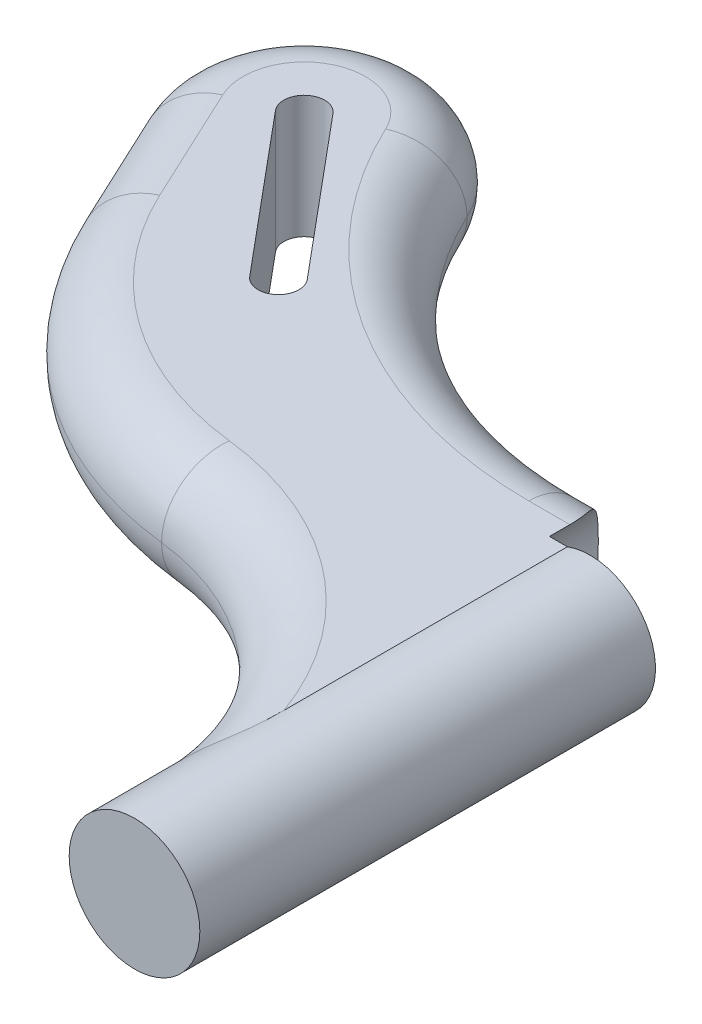
ISO-10303-21;
HEADER;
FILE_DESCRIPTION(('STEP AP214'),'2;1');
FILE_NAME('part.step','',(''),(''),'','','');
FILE_SCHEMA(('AUTOMOTIVE_DESIGN { 1 0 10303 214 1 1 1 1 }'));
ENDSEC;
DATA;
#1=APPLICATION_CONTEXT('core data for automotive mechanical design processes');
#2=APPLICATION_PROTOCOL_DEFINITION('international standard','automotive_design',2000,#1);
#3=PRODUCT_CONTEXT('',#1,'mechanical');
#4=PRODUCT('Part','Part','',(#3));
#5=PRODUCT_RELATED_PRODUCT_CATEGORY('part','',(#4));
#6=PRODUCT_DEFINITION_FORMATION('','',#4);
#7=PRODUCT_DEFINITION_CONTEXT('part definition',#1,'design');
#8=PRODUCT_DEFINITION('design','',#6,#7);
#9=PRODUCT_DEFINITION_SHAPE('','',#8);
#10=(LENGTH_UNIT() NAMED_UNIT(*) SI_UNIT(.MILLI.,.METRE.));
#11=(NAMED_UNIT(*) PLANE_ANGLE_UNIT() SI_UNIT($,.RADIAN.));
#12=(NAMED_UNIT(*) SI_UNIT($,.STERADIAN.) SOLID_ANGLE_UNIT());
#13=UNCERTAINTY_MEASURE_WITH_UNIT(LENGTH_MEASURE(1.E-05),#10,'distance_accuracy_value','');
#14=(GEOMETRIC_REPRESENTATION_CONTEXT(3) GLOBAL_UNCERTAINTY_ASSIGNED_CONTEXT((#13)) GLOBAL_UNIT_ASSIGNED_CONTEXT((#10,
#11,#12)) REPRESENTATION_CONTEXT('',''));
#15=CARTESIAN_POINT('',(0.,0.,0.));
#16=DIRECTION('',(0.,0.,1.));
#17=DIRECTION('',(1.,0.,0.));
#18=AXIS2_PLACEMENT_3D('',#15,#16,#17);
#19=CARTESIAN_POINT('',(0.,0.,55.7812022947244));
#20=DIRECTION('',(0.,0.,-1.));
#21=DIRECTION('',(-1.,0.,0.));
#22=AXIS2_PLACEMENT_3D('',#19,#20,#21);
#23=CYLINDRICAL_SURFACE('',#22,8.);
#24=CARTESIAN_POINT('',(0.,0.,55.7812022947244));
#25=DIRECTION('',(0.,0.,1.));
#26=DIRECTION('',(1.,0.,0.));
#27=AXIS2_PLACEMENT_3D('',#24,#25,#26);
#28=CIRCLE('',#27,8.);
#29=CARTESIAN_POINT('',(8.,0.,55.7812022947244));
#30=VERTEX_POINT('',#29);
#31=EDGE_CURVE('E297',#30,#30,#28,.T.);
#32=ORIENTED_EDGE('',*,*,#31,.F.);
#33=EDGE_LOOP('',(#32));
#34=FACE_BOUND('',#33,.T.);
#35=CARTESIAN_POINT('',(0.,0.,0.));
#36=DIRECTION('',(0.,0.,1.));
#37=DIRECTION('',(1.,0.,0.));
#38=AXIS2_PLACEMENT_3D('',#35,#36,#37);
#39=CIRCLE('',#38,8.);
#40=CARTESIAN_POINT('',(-2.78388218141501,-7.5,0.));
#41=VERTEX_POINT('',#40);
#42=CARTESIAN_POINT('',(-2.78388218141501,7.5,0.));
#43=VERTEX_POINT('',#42);
#44=EDGE_CURVE('E296',#41,#43,#39,.T.);
#45=ORIENTED_EDGE('',*,*,#44,.T.);
#46=DIRECTION('',(0.,0.,-1.));
#47=VECTOR('',#46,1.);
#48=CARTESIAN_POINT('',(-2.78388218141501,7.5,55.7812022947244));
#49=LINE('',#48,#47);
#50=CARTESIAN_POINT('',(-2.78388218141501,7.5,34.7054964529015));
#51=VERTEX_POINT('',#50);
#52=EDGE_CURVE('E293',#43,#51,#49,.F.);
#53=ORIENTED_EDGE('',*,*,#52,.T.);
#54=CARTESIAN_POINT('',(-2.78388218141501,7.5,34.7054964529015));
#55=CARTESIAN_POINT('',(-2.78388986133259,7.49998879733099,34.9081310723793));
#56=CARTESIAN_POINT('',(-2.7864249794609,7.49905548058002,35.1107826448711));
#57=CARTESIAN_POINT('',(-2.797042360026,7.49510646700193,35.5159737838452));
#58=CARTESIAN_POINT('',(-2.8051261631435,7.49209019180684,35.7185133035778));
#59=CARTESIAN_POINT('',(-2.8273782115901,7.48372011718175,36.1240323776373));
#60=CARTESIAN_POINT('',(-2.84157070508225,7.47835700064506,36.3270104436705));
#61=CARTESIAN_POINT('',(-2.87658790636255,7.46495796283074,36.7322974147067));
#62=CARTESIAN_POINT('',(-2.89741212579398,7.45692223836057,36.9346063678747));
#63=CARTESIAN_POINT('',(-2.9465426725394,7.43764698960185,37.3405763028178));
#64=CARTESIAN_POINT('',(-2.97493361644897,7.42637111252841,37.5442254447394));
#65=CARTESIAN_POINT('',(-3.03965950764796,7.40011429539319,37.9500137556285));
#66=CARTESIAN_POINT('',(-3.07599390013127,7.38513361408199,38.1521530290327));
#67=CARTESIAN_POINT('',(-3.15708561311718,7.35083326203775,38.5540708021967));
#68=CARTESIAN_POINT('',(-3.20183054857966,7.33151996335971,38.7538523199055));
#69=CARTESIAN_POINT('',(-3.30019250632164,7.28777195509469,39.1506260519653));
#70=CARTESIAN_POINT('',(-3.35380824504245,7.26333798630562,39.3476186653861));
#71=CARTESIAN_POINT('',(-3.48935259611688,7.19942864529725,39.8023638939905));
#72=CARTESIAN_POINT('',(-3.57479112398436,7.15764964722115,40.0587680863809));
#73=CARTESIAN_POINT('',(-3.76170411738121,7.06120535492036,40.5632192179881));
#74=CARTESIAN_POINT('',(-3.86317916051539,7.00653959650417,40.811265855791));
#75=CARTESIAN_POINT('',(-4.08021380477258,6.88239517570194,41.2953430992938));
#76=CARTESIAN_POINT('',(-4.19568046411844,6.81301218744254,41.531439666026));
#77=CARTESIAN_POINT('',(-4.43873030824773,6.65721240666456,41.9914713325426));
#78=CARTESIAN_POINT('',(-4.56631318865716,6.57079604198619,42.2154067376078));
#79=CARTESIAN_POINT('',(-4.83057223580671,6.37905123429949,42.6507787574292));
#80=CARTESIAN_POINT('',(-4.96728255865436,6.27364892214378,42.862162104892));
#81=CARTESIAN_POINT('',(-5.24502811790198,6.04336007726362,43.2710173261688));
#82=CARTESIAN_POINT('',(-5.38606358141553,5.91847251995457,43.46848846765));
#83=CARTESIAN_POINT('',(-5.66823372139364,5.64883102584305,43.850303171234));
#84=CARTESIAN_POINT('',(-5.80936772586525,5.50402699749835,44.0346117942918));
#85=CARTESIAN_POINT('',(-6.08689628185587,5.19545442268897,44.3904564017822));
#86=CARTESIAN_POINT('',(-6.22329085961137,5.03168598122919,44.561992456927));
#87=CARTESIAN_POINT('',(-6.48442161982078,4.69014847034898,44.8900273628807));
#88=CARTESIAN_POINT('',(-6.60934572640553,4.5127572698585,45.0467706402982));
#89=CARTESIAN_POINT('',(-6.84744151552175,4.14258080127026,45.3507201484455));
#90=CARTESIAN_POINT('',(-6.9606129063609,3.94979515130541,45.4979261424341));
#91=CARTESIAN_POINT('',(-7.17234548975785,3.550837287048,45.7842297808205));
#92=CARTESIAN_POINT('',(-7.27091382579991,3.34467168937667,45.9233313693696));
#93=CARTESIAN_POINT('',(-7.45121359025614,2.92102574592506,46.1950054562381));
#94=CARTESIAN_POINT('',(-7.53294774548688,2.70354723978019,46.3275790093234));
#95=CARTESIAN_POINT('',(-7.66167683254452,2.30904360708731,46.558718521267));
#96=CARTESIAN_POINT('',(-7.71235463567888,2.13379286331805,46.6582840834686));
#97=CARTESIAN_POINT('',(-7.80183553748371,1.77899428557979,46.8550598115985));
#98=CARTESIAN_POINT('',(-7.84063939866372,1.5994467283382,46.9522701284044));
#99=CARTESIAN_POINT('',(-7.90584275380298,1.23750584034814,47.1448600109172));
#100=CARTESIAN_POINT('',(-7.93226068691405,1.05511716019111,47.240242093992));
#101=CARTESIAN_POINT('',(-7.97245337893073,0.688462631997456,47.4299644468027));
#102=CARTESIAN_POINT('',(-7.98623167066883,0.504197323054459,47.5243050003626));
#103=CARTESIAN_POINT('',(-7.99704826664475,0.233704659132697,47.6622560980201));
#104=CARTESIAN_POINT('',(-7.99909804991712,0.147732579593983,47.7060226857116));
#105=CARTESIAN_POINT('',(-7.99992055756079,0.0411651923017252,47.7602550066956));
#106=CARTESIAN_POINT('',(-7.99999999372569,0.0205825908317495,47.7707286529546));
#107=CARTESIAN_POINT('',(-8.,0.,47.7812022947244));
#108=B_SPLINE_CURVE_WITH_KNOTS('',3,(#54,#55,#56,#57,#58,#59,#60,#61,#62,#63,#64,#65,#66,#67,
#68,#69,#70,#71,#72,#73,#74,#75,#76,#77,#78,#79,#80,#81,#82,#83,#84,#85,#86,#87,#88,#89,#90,#91,
#92,#93,#94,#95,#96,#97,#98,#99,#100,#101,#102,#103,#104,#105,#106,#107),.UNSPECIFIED.,.F.,.F.,
(4,2,2,2,2,2,2,2,2,2,2,2,2,2,2,2,2,2,2,2,2,2,2,2,2,2,4),(0.,0.607911330137542,1.21599152484917,
1.82650805416492,2.43697963576553,3.05458732567561,3.67215189286422,4.28881408339896,
4.90538712405764,5.72495394730566,6.54455029652457,7.35897350587093,8.17337626133872,
8.99101890733021,9.80870456158517,10.6284857057536,11.4482623110563,12.2503688019479,
13.0524951956793,13.8542279024473,14.6558306414795,15.2789528223986,15.9020349798464,
16.5241865750936,17.146164223345,17.4356083435784,17.504890785698),.UNSPECIFIED.);
#109=CARTESIAN_POINT('',(-8.,0.,47.7812022947244));
#110=VERTEX_POINT('',#109);
#111=EDGE_CURVE('E11',#51,#110,#108,.T.);
#112=ORIENTED_EDGE('',*,*,#111,.T.);
#113=CARTESIAN_POINT('',(-2.78388218141501,-7.5,34.7054964529015));
#114=CARTESIAN_POINT('',(-2.78388986133259,-7.49998879733099,34.9081310723793));
#115=CARTESIAN_POINT('',(-2.7864249794609,-7.49905548058002,35.1107826448711));
#116=CARTESIAN_POINT('',(-2.797042360026,-7.49510646700193,35.5159737838452));
#117=CARTESIAN_POINT('',(-2.8051261631435,-7.49209019180684,35.7185133035778));
#118=CARTESIAN_POINT('',(-2.8273782115901,-7.48372011718175,36.1240323776373));
#119=CARTESIAN_POINT('',(-2.84157070508225,-7.47835700064506,36.3270104436705));
#120=CARTESIAN_POINT('',(-2.87658790636255,-7.46495796283074,36.7322974147067));
#121=CARTESIAN_POINT('',(-2.89741212579398,-7.45692223836057,36.9346063678747));
#122=CARTESIAN_POINT('',(-2.9465426725394,-7.43764698960185,37.3405763028178));
#123=CARTESIAN_POINT('',(-2.97493361644897,-7.42637111252841,37.5442254447394));
#124=CARTESIAN_POINT('',(-3.03965950764796,-7.40011429539319,37.9500137556285));
#125=CARTESIAN_POINT('',(-3.07599390013127,-7.38513361408199,38.1521530290327));
#126=CARTESIAN_POINT('',(-3.15708561311718,-7.35083326203775,38.5540708021967));
#127=CARTESIAN_POINT('',(-3.20183054857966,-7.33151996335971,38.7538523199055));
#128=CARTESIAN_POINT('',(-3.30019250632164,-7.28777195509469,39.1506260519653));
#129=CARTESIAN_POINT('',(-3.35380824504245,-7.26333798630562,39.3476186653861));
#130=CARTESIAN_POINT('',(-3.48935259611688,-7.19942864529725,39.8023638939905));
#131=CARTESIAN_POINT('',(-3.57479112398436,-7.15764964722115,40.0587680863809));
#132=CARTESIAN_POINT('',(-3.76170411738121,-7.06120535492036,40.5632192179881));
#133=CARTESIAN_POINT('',(-3.86317916051539,-7.00653959650417,40.811265855791));
#134=CARTESIAN_POINT('',(-4.08021380477258,-6.88239517570194,41.2953430992938));
#135=CARTESIAN_POINT('',(-4.19568046411844,-6.81301218744254,41.531439666026));
#136=CARTESIAN_POINT('',(-4.43873030824773,-6.65721240666456,41.9914713325426));
#137=CARTESIAN_POINT('',(-4.56631318865716,-6.57079604198619,42.2154067376078));
#138=CARTESIAN_POINT('',(-4.83057223580671,-6.37905123429949,42.6507787574292));
#139=CARTESIAN_POINT('',(-4.96728255865436,-6.27364892214378,42.862162104892));
#140=CARTESIAN_POINT('',(-5.24502811790198,-6.04336007726362,43.2710173261688));
#141=CARTESIAN_POINT('',(-5.38606358141553,-5.91847251995457,43.46848846765));
#142=CARTESIAN_POINT('',(-5.66823372139364,-5.64883102584305,43.850303171234));
#143=CARTESIAN_POINT('',(-5.80936772586525,-5.50402699749835,44.0346117942918));
#144=CARTESIAN_POINT('',(-6.08689628185587,-5.19545442268897,44.3904564017822));
#145=CARTESIAN_POINT('',(-6.22329085961137,-5.03168598122919,44.561992456927));
#146=CARTESIAN_POINT('',(-6.48442161982078,-4.69014847034898,44.8900273628807));
#147=CARTESIAN_POINT('',(-6.60934572640553,-4.5127572698585,45.0467706402982));
#148=CARTESIAN_POINT('',(-6.84744151552175,-4.14258080127026,45.3507201484455));
#149=CARTESIAN_POINT('',(-6.9606129063609,-3.94979515130541,45.4979261424341));
#150=CARTESIAN_POINT('',(-7.17234548975785,-3.550837287048,45.7842297808205));
#151=CARTESIAN_POINT('',(-7.27091382579991,-3.34467168937667,45.9233313693696));
#152=CARTESIAN_POINT('',(-7.45121359025614,-2.92102574592506,46.1950054562381));
#153=CARTESIAN_POINT('',(-7.53294774548688,-2.70354723978019,46.3275790093234));
#154=CARTESIAN_POINT('',(-7.66167683254452,-2.30904360708731,46.558718521267));
#155=CARTESIAN_POINT('',(-7.71235463567888,-2.13379286331805,46.6582840834686));
#156=CARTESIAN_POINT('',(-7.80183553748371,-1.77899428557979,46.8550598115985));
#157=CARTESIAN_POINT('',(-7.84063939866372,-1.5994467283382,46.9522701284044));
#158=CARTESIAN_POINT('',(-7.90584275380298,-1.23750584034814,47.1448600109172));
#159=CARTESIAN_POINT('',(-7.93226068691405,-1.05511716019111,47.240242093992));
#160=CARTESIAN_POINT('',(-7.97245337893073,-0.688462631997456,47.4299644468027));
#161=CARTESIAN_POINT('',(-7.98623167066883,-0.504197323054459,47.5243050003626));
#162=CARTESIAN_POINT('',(-7.99704826664475,-0.233704659132697,47.6622560980201));
#163=CARTESIAN_POINT('',(-7.99909804991712,-0.147732579593983,47.7060226857116));
#164=CARTESIAN_POINT('',(-7.99992055756079,-0.0411651923017252,47.7602550066956));
#165=CARTESIAN_POINT('',(-7.99999999372569,-0.0205825908317495,47.7707286529546));
#166=CARTESIAN_POINT('',(-8.,0.,47.7812022947244));
#167=B_SPLINE_CURVE_WITH_KNOTS('',3,(#113,#114,#115,#116,#117,#118,#119,#120,#121,#122,#123,
#124,#125,#126,#127,#128,#129,#130,#131,#132,#133,#134,#135,#136,#137,#138,#139,#140,#141,#142,
#143,#144,#145,#146,#147,#148,#149,#150,#151,#152,#153,#154,#155,#156,#157,#158,#159,#160,#161,
#162,#163,#164,#165,#166),.UNSPECIFIED.,.F.,.F.,(4,2,2,2,2,2,2,2,2,2,2,2,2,2,2,2,2,2,2,2,2,2,2,
2,2,2,4),(0.,0.607911330137542,1.21599152484917,1.82650805416492,2.43697963576553,
3.05458732567561,3.67215189286422,4.28881408339896,4.90538712405764,5.72495394730566,
6.54455029652457,7.35897350587093,8.17337626133872,8.99101890733021,9.80870456158517,
10.6284857057536,11.4482623110563,12.2503688019479,13.0524951956793,13.8542279024473,
14.6558306414795,15.2789528223986,15.9020349798464,16.5241865750936,17.146164223345,
17.4356083435784,17.504890785698),.UNSPECIFIED.);
#168=CARTESIAN_POINT('',(-2.78388218141501,-7.5,34.7054964529015));
#169=VERTEX_POINT('',#168);
#170=EDGE_CURVE('E53',#110,#169,#167,.F.);
#171=ORIENTED_EDGE('',*,*,#170,.T.);
#172=DIRECTION('',(0.,0.,-1.));
#173=VECTOR('',#172,1.);
#174=CARTESIAN_POINT('',(-2.78388218141501,-7.5,55.7812022947244));
#175=LINE('',#174,#173);
#176=EDGE_CURVE('E289',#41,#169,#175,.F.);
#177=ORIENTED_EDGE('',*,*,#176,.F.);
#178=EDGE_LOOP('',(#45,#53,#112,#171,#177));
#179=FACE_BOUND('',#178,.T.);
#180=ADVANCED_FACE('F41',(#34,#179),#23,.T.);
#181=CARTESIAN_POINT('',(0.,0.,55.7812022947244));
#182=DIRECTION('',(0.,0.,1.));
#183=DIRECTION('',(1.,0.,0.));
#184=AXIS2_PLACEMENT_3D('',#181,#182,#183);
#185=PLANE('',#184);
#186=ORIENTED_EDGE('',*,*,#31,.T.);
#187=EDGE_LOOP('',(#186));
#188=FACE_BOUND('',#187,.T.);
#189=ADVANCED_FACE('F374',(#188),#185,.T.);
#190=CARTESIAN_POINT('',(0.,0.,0.));
#191=DIRECTION('',(0.,0.,1.));
#192=DIRECTION('',(1.,0.,0.));
#193=AXIS2_PLACEMENT_3D('',#190,#191,#192);
#194=PLANE('',#193);
#195=DIRECTION('',(1.,0.,0.));
#196=VECTOR('',#195,1.);
#197=CARTESIAN_POINT('',(0.,7.5,0.));
#198=LINE('',#197,#196);
#199=CARTESIAN_POINT('',(-4.97493718553309,7.5,0.));
#200=VERTEX_POINT('',#199);
#201=EDGE_CURVE('E242',#200,#43,#198,.T.);
#202=ORIENTED_EDGE('',*,*,#201,.T.);
#203=ORIENTED_EDGE('',*,*,#44,.F.);
#204=DIRECTION('',(1.,0.,0.));
#205=VECTOR('',#204,1.);
#206=CARTESIAN_POINT('',(0.,-7.5,0.));
#207=LINE('',#206,#205);
#208=CARTESIAN_POINT('',(-4.97493718553309,-7.5,0.));
#209=VERTEX_POINT('',#208);
#210=EDGE_CURVE('E301',#209,#41,#207,.T.);
#211=ORIENTED_EDGE('',*,*,#210,.F.);
#212=CARTESIAN_POINT('',(0.,0.,0.));
#213=DIRECTION('',(0.,0.,-1.));
#214=DIRECTION('',(-1.,0.,0.));
#215=AXIS2_PLACEMENT_3D('',#212,#213,#214);
#216=CIRCLE('',#215,8.99999999999999);
#217=EDGE_CURVE('E230',#209,#200,#216,.T.);
#218=ORIENTED_EDGE('',*,*,#217,.T.);
#219=EDGE_LOOP('',(#202,#203,#211,#218));
#220=FACE_BOUND('',#219,.T.);
#221=ADVANCED_FACE('F355',(#220),#194,.F.);
#222=CARTESIAN_POINT('',(0.,7.5,0.));
#223=DIRECTION('',(0.,1.,0.));
#224=DIRECTION('',(0.,0.,1.));
#225=AXIS2_PLACEMENT_3D('',#222,#223,#224);
#226=PLANE('',#225);
#227=DIRECTION('',(0.,0.,-1.));
#228=VECTOR('',#227,1.);
#229=CARTESIAN_POINT('',(-4.97493718553308,7.5,0.));
#230=LINE('',#229,#228);
#231=CARTESIAN_POINT('',(-4.97493718553308,7.5,-2.5));
#232=VERTEX_POINT('',#231);
#233=EDGE_CURVE('E96',#232,#200,#230,.F.);
#234=ORIENTED_EDGE('',*,*,#233,.F.);
#235=DIRECTION('',(-1.,0.,0.));
#236=VECTOR('',#235,1.);
#237=CARTESIAN_POINT('',(-10.,7.5,-2.5));
#238=LINE('',#237,#236);
#239=CARTESIAN_POINT('',(-10.,7.5,-2.5));
#240=VERTEX_POINT('',#239);
#241=EDGE_CURVE('E177',#232,#240,#238,.T.);
#242=ORIENTED_EDGE('',*,*,#241,.T.);
#243=CARTESIAN_POINT('',(-10.,7.5,-55.7142857142857));
#244=DIRECTION('',(0.,1.,0.));
#245=DIRECTION('',(0.,0.,1.));
#246=AXIS2_PLACEMENT_3D('',#243,#244,#245);
#247=CIRCLE('',#246,53.2142857142857);
#248=CARTESIAN_POINT('',(-58.2058823529412,7.5,-33.1764705882353));
#249=VERTEX_POINT('',#248);
#250=EDGE_CURVE('E170',#240,#249,#247,.F.);
#251=ORIENTED_EDGE('',*,*,#250,.T.);
#252=CARTESIAN_POINT('',(-65.,7.5,-30.));
#253=DIRECTION('',(0.,1.,0.));
#254=DIRECTION('',(0.,0.,1.));
#255=AXIS2_PLACEMENT_3D('',#252,#253,#254);
#256=CIRCLE('',#255,7.5);
#257=CARTESIAN_POINT('',(-71.7941176470588,7.5,-26.8235294117647));
#258=VERTEX_POINT('',#257);
#259=EDGE_CURVE('E174',#249,#258,#256,.T.);
#260=ORIENTED_EDGE('',*,*,#259,.T.);
#261=DIRECTION('',(0.423529411764705,0.,0.905882352941177));
#262=VECTOR('',#261,1.);
#263=CARTESIAN_POINT('',(-65.0176470588235,7.5,-12.3294117647059));
#264=LINE('',#263,#262);
#265=CARTESIAN_POINT('',(-65.0176470588235,7.5,-12.3294117647059));
#266=VERTEX_POINT('',#265);
#267=EDGE_CURVE('E191',#258,#266,#264,.T.);
#268=ORIENTED_EDGE('',*,*,#267,.T.);
#269=CARTESIAN_POINT('',(-30.4,7.5,-28.5142857142857));
#270=DIRECTION('',(0.,1.,0.));
#271=DIRECTION('',(0.,0.,1.));
#272=AXIS2_PLACEMENT_3D('',#269,#270,#271);
#273=CIRCLE('',#272,38.2142857142857);
#274=CARTESIAN_POINT('',(-34.7160318218035,7.5,9.455485182656));
#275=VERTEX_POINT('',#274);
#276=EDGE_CURVE('E428',#266,#275,#273,.T.);
#277=ORIENTED_EDGE('',*,*,#276,.T.);
#278=CARTESIAN_POINT('',(-39.0725241245382,7.5,47.7812022947244));
#279=DIRECTION('',(0.,1.,0.));
#280=DIRECTION('',(0.,0.,1.));
#281=AXIS2_PLACEMENT_3D('',#278,#279,#280);
#282=CIRCLE('',#281,38.5725241245382);
#283=EDGE_CURVE('E431',#275,#51,#282,.F.);
#284=ORIENTED_EDGE('',*,*,#283,.T.);
#285=ORIENTED_EDGE('',*,*,#52,.F.);
#286=ORIENTED_EDGE('',*,*,#201,.F.);
#287=EDGE_LOOP('',(#234,#242,#251,#260,#268,#277,#284,#285,#286));
#288=FACE_BOUND('',#287,.T.);
#289=CARTESIAN_POINT('',(-48.9688662576281,7.5,-10.8166022057044));
#290=DIRECTION('',(0.,1.,0.));
#291=DIRECTION('',(0.,0.,1.));
#292=AXIS2_PLACEMENT_3D('',#289,#290,#291);
#293=CIRCLE('',#292,2.5);
#294=CARTESIAN_POINT('',(-50.8872060370576,7.5,-9.21348883146725));
#295=VERTEX_POINT('',#294);
#296=CARTESIAN_POINT('',(-47.0505264781985,7.5,-12.4197155799416));
#297=VERTEX_POINT('',#296);
#298=EDGE_CURVE('E246',#295,#297,#293,.T.);
#299=ORIENTED_EDGE('',*,*,#298,.F.);
#300=DIRECTION('',(0.641245349694878,0.,0.767335911771822));
#301=VECTOR('',#300,1.);
#302=CARTESIAN_POINT('',(-25.4291083242579,7.5,21.2505334491194));
#303=LINE('',#302,#301);
#304=CARTESIAN_POINT('',(-66.9183397794295,7.5,-28.3968866257628));
#305=VERTEX_POINT('',#304);
#306=EDGE_CURVE('E250',#305,#295,#303,.T.);
#307=ORIENTED_EDGE('',*,*,#306,.F.);
#308=CARTESIAN_POINT('',(-65.,7.5,-30.));
#309=DIRECTION('',(0.,1.,0.));
#310=DIRECTION('',(0.,0.,1.));
#311=AXIS2_PLACEMENT_3D('',#308,#309,#310);
#312=CIRCLE('',#311,2.5);
#313=CARTESIAN_POINT('',(-63.0816602205705,7.5,-31.6031133742372));
#314=VERTEX_POINT('',#313);
#315=EDGE_CURVE('E255',#314,#305,#312,.T.);
#316=ORIENTED_EDGE('',*,*,#315,.F.);
#317=DIRECTION('',(-0.641245349694878,0.,-0.767335911771822));
#318=VECTOR('',#317,1.);
#319=CARTESIAN_POINT('',(-21.5924287653987,7.5,18.044306700645));
#320=LINE('',#319,#318);
#321=EDGE_CURVE('E259',#297,#314,#320,.T.);
#322=ORIENTED_EDGE('',*,*,#321,.F.);
#323=EDGE_LOOP('',(#299,#307,#316,#322));
#324=FACE_BOUND('',#323,.T.);
#325=ADVANCED_FACE('F172',(#288,#324),#226,.T.);
#326=CARTESIAN_POINT('',(0.,-7.5,0.));
#327=DIRECTION('',(0.,1.,0.));
#328=DIRECTION('',(0.,0.,1.));
#329=AXIS2_PLACEMENT_3D('',#326,#327,#328);
#330=PLANE('',#329);
#331=CARTESIAN_POINT('',(-48.9688662576281,-7.5,-10.8166022057044));
#332=DIRECTION('',(0.,1.,0.));
#333=DIRECTION('',(0.,0.,1.));
#334=AXIS2_PLACEMENT_3D('',#331,#332,#333);
#335=CIRCLE('',#334,2.5);
#336=CARTESIAN_POINT('',(-50.8872060370576,-7.5,-9.21348883146725));
#337=VERTEX_POINT('',#336);
#338=CARTESIAN_POINT('',(-47.0505264781985,-7.5,-12.4197155799416));
#339=VERTEX_POINT('',#338);
#340=EDGE_CURVE('E245',#337,#339,#335,.T.);
#341=ORIENTED_EDGE('',*,*,#340,.T.);
#342=DIRECTION('',(-0.641245349694878,0.,-0.767335911771822));
#343=VECTOR('',#342,1.);
#344=CARTESIAN_POINT('',(-21.5924287653987,-7.5,18.044306700645));
#345=LINE('',#344,#343);
#346=CARTESIAN_POINT('',(-63.0816602205705,-7.5,-31.6031133742372));
#347=VERTEX_POINT('',#346);
#348=EDGE_CURVE('E251',#339,#347,#345,.T.);
#349=ORIENTED_EDGE('',*,*,#348,.T.);
#350=CARTESIAN_POINT('',(-65.,-7.5,-30.));
#351=DIRECTION('',(0.,1.,0.));
#352=DIRECTION('',(0.,0.,1.));
#353=AXIS2_PLACEMENT_3D('',#350,#351,#352);
#354=CIRCLE('',#353,2.5);
#355=CARTESIAN_POINT('',(-66.9183397794295,-7.5,-28.3968866257628));
#356=VERTEX_POINT('',#355);
#357=EDGE_CURVE('E271',#347,#356,#354,.T.);
#358=ORIENTED_EDGE('',*,*,#357,.T.);
#359=DIRECTION('',(0.641245349694878,0.,0.767335911771822));
#360=VECTOR('',#359,1.);
#361=CARTESIAN_POINT('',(-25.4291083242579,-7.5,21.2505334491194));
#362=LINE('',#361,#360);
#363=EDGE_CURVE('E267',#356,#337,#362,.T.);
#364=ORIENTED_EDGE('',*,*,#363,.T.);
#365=EDGE_LOOP('',(#341,#349,#358,#364));
#366=FACE_BOUND('',#365,.T.);
#367=CARTESIAN_POINT('',(-10.,-7.5,-55.7142857142857));
#368=DIRECTION('',(0.,1.,0.));
#369=DIRECTION('',(0.,0.,1.));
#370=AXIS2_PLACEMENT_3D('',#367,#368,#369);
#371=CIRCLE('',#370,53.2142857142857);
#372=CARTESIAN_POINT('',(-58.2058823529412,-7.5,-33.1764705882353));
#373=VERTEX_POINT('',#372);
#374=CARTESIAN_POINT('',(-10.,-7.5,-2.5));
#375=VERTEX_POINT('',#374);
#376=EDGE_CURVE('E319',#373,#375,#371,.T.);
#377=ORIENTED_EDGE('',*,*,#376,.T.);
#378=DIRECTION('',(-1.,0.,0.));
#379=VECTOR('',#378,1.);
#380=CARTESIAN_POINT('',(0.,-7.5,-2.5));
#381=LINE('',#380,#379);
#382=CARTESIAN_POINT('',(-4.97493718553308,-7.5,-2.5));
#383=VERTEX_POINT('',#382);
#384=EDGE_CURVE('E322',#375,#383,#381,.F.);
#385=ORIENTED_EDGE('',*,*,#384,.T.);
#386=DIRECTION('',(0.,0.,-1.));
#387=VECTOR('',#386,1.);
#388=CARTESIAN_POINT('',(-4.97493718553308,-7.5,0.));
#389=LINE('',#388,#387);
#390=EDGE_CURVE('E232',#383,#209,#389,.F.);
#391=ORIENTED_EDGE('',*,*,#390,.T.);
#392=ORIENTED_EDGE('',*,*,#210,.T.);
#393=ORIENTED_EDGE('',*,*,#176,.T.);
#394=CARTESIAN_POINT('',(-39.0725241245382,-7.5,47.7812022947244));
#395=DIRECTION('',(0.,1.,0.));
#396=DIRECTION('',(0.,0.,1.));
#397=AXIS2_PLACEMENT_3D('',#394,#395,#396);
#398=CIRCLE('',#397,38.5725241245382);
#399=CARTESIAN_POINT('',(-34.7160318218035,-7.5,9.455485182656));
#400=VERTEX_POINT('',#399);
#401=EDGE_CURVE('E307',#169,#400,#398,.T.);
#402=ORIENTED_EDGE('',*,*,#401,.T.);
#403=CARTESIAN_POINT('',(-30.4,-7.5,-28.5142857142857));
#404=DIRECTION('',(0.,1.,0.));
#405=DIRECTION('',(0.,0.,1.));
#406=AXIS2_PLACEMENT_3D('',#403,#404,#405);
#407=CIRCLE('',#406,38.2142857142857);
#408=CARTESIAN_POINT('',(-65.0176470588235,-7.5,-12.3294117647059));
#409=VERTEX_POINT('',#408);
#410=EDGE_CURVE('E310',#400,#409,#407,.F.);
#411=ORIENTED_EDGE('',*,*,#410,.T.);
#412=DIRECTION('',(0.423529411764705,0.,0.905882352941177));
#413=VECTOR('',#412,1.);
#414=CARTESIAN_POINT('',(-48.6245674740485,-7.5,22.7335640138408));
#415=LINE('',#414,#413);
#416=CARTESIAN_POINT('',(-71.7941176470588,-7.5,-26.8235294117647));
#417=VERTEX_POINT('',#416);
#418=EDGE_CURVE('E313',#409,#417,#415,.F.);
#419=ORIENTED_EDGE('',*,*,#418,.T.);
#420=CARTESIAN_POINT('',(-65.,-7.5,-30.));
#421=DIRECTION('',(0.,1.,0.));
#422=DIRECTION('',(0.,0.,1.));
#423=AXIS2_PLACEMENT_3D('',#420,#421,#422);
#424=CIRCLE('',#423,7.5);
#425=EDGE_CURVE('E316',#417,#373,#424,.F.);
#426=ORIENTED_EDGE('',*,*,#425,.T.);
#427=EDGE_LOOP('',(#377,#385,#391,#392,#393,#402,#411,#419,#426));
#428=FACE_BOUND('',#427,.T.);
#429=ADVANCED_FACE('F354',(#366,#428),#330,.F.);
#430=CARTESIAN_POINT('',(-48.9688662576281,7.5,-10.8166022057044));
#431=DIRECTION('',(0.,-1.,0.));
#432=DIRECTION('',(0.,0.,-1.));
#433=AXIS2_PLACEMENT_3D('',#430,#431,#432);
#434=CYLINDRICAL_SURFACE('',#433,2.5);
#435=ORIENTED_EDGE('',*,*,#340,.F.);
#436=DIRECTION('',(0.,-1.,0.));
#437=VECTOR('',#436,1.);
#438=CARTESIAN_POINT('',(-50.8872060370576,7.5,-9.21348883146725));
#439=LINE('',#438,#437);
#440=EDGE_CURVE('E286',#295,#337,#439,.T.);
#441=ORIENTED_EDGE('',*,*,#440,.F.);
#442=ORIENTED_EDGE('',*,*,#298,.T.);
#443=DIRECTION('',(0.,-1.,0.));
#444=VECTOR('',#443,1.);
#445=CARTESIAN_POINT('',(-47.0505264781985,7.5,-12.4197155799416));
#446=LINE('',#445,#444);
#447=EDGE_CURVE('E263',#297,#339,#446,.T.);
#448=ORIENTED_EDGE('',*,*,#447,.T.);
#449=EDGE_LOOP('',(#435,#441,#442,#448));
#450=FACE_BOUND('',#449,.T.);
#451=ADVANCED_FACE('F358',(#450),#434,.F.);
#452=CARTESIAN_POINT('',(-25.4291083242579,7.5,21.2505334491194));
#453=DIRECTION('',(0.767335911771822,0.,-0.641245349694878));
#454=DIRECTION('',(-0.641245349694878,0.,-0.767335911771822));
#455=AXIS2_PLACEMENT_3D('',#452,#453,#454);
#456=PLANE('',#455);
#457=ORIENTED_EDGE('',*,*,#363,.F.);
#458=DIRECTION('',(0.,-1.,0.));
#459=VECTOR('',#458,1.);
#460=CARTESIAN_POINT('',(-66.9183397794295,7.5,-28.3968866257628));
#461=LINE('',#460,#459);
#462=EDGE_CURVE('E283',#305,#356,#461,.T.);
#463=ORIENTED_EDGE('',*,*,#462,.F.);
#464=ORIENTED_EDGE('',*,*,#306,.T.);
#465=ORIENTED_EDGE('',*,*,#440,.T.);
#466=EDGE_LOOP('',(#457,#463,#464,#465));
#467=FACE_BOUND('',#466,.T.);
#468=ADVANCED_FACE('F366',(#467),#456,.T.);
#469=CARTESIAN_POINT('',(-65.,7.5,-30.));
#470=DIRECTION('',(0.,-1.,0.));
#471=DIRECTION('',(0.,0.,-1.));
#472=AXIS2_PLACEMENT_3D('',#469,#470,#471);
#473=CYLINDRICAL_SURFACE('',#472,2.5);
#474=ORIENTED_EDGE('',*,*,#357,.F.);
#475=DIRECTION('',(0.,-1.,0.));
#476=VECTOR('',#475,1.);
#477=CARTESIAN_POINT('',(-63.0816602205705,7.5,-31.6031133742372));
#478=LINE('',#477,#476);
#479=EDGE_CURVE('E280',#314,#347,#478,.T.);
#480=ORIENTED_EDGE('',*,*,#479,.F.);
#481=ORIENTED_EDGE('',*,*,#315,.T.);
#482=ORIENTED_EDGE('',*,*,#462,.T.);
#483=EDGE_LOOP('',(#474,#480,#481,#482));
#484=FACE_BOUND('',#483,.T.);
#485=ADVANCED_FACE('F362',(#484),#473,.F.);
#486=CARTESIAN_POINT('',(-21.5924287653987,7.5,18.044306700645));
#487=DIRECTION('',(-0.767335911771822,0.,0.641245349694878));
#488=DIRECTION('',(0.641245349694878,0.,0.767335911771822));
#489=AXIS2_PLACEMENT_3D('',#486,#487,#488);
#490=PLANE('',#489);
#491=ORIENTED_EDGE('',*,*,#348,.F.);
#492=ORIENTED_EDGE('',*,*,#447,.F.);
#493=ORIENTED_EDGE('',*,*,#321,.T.);
#494=ORIENTED_EDGE('',*,*,#479,.T.);
#495=EDGE_LOOP('',(#491,#492,#493,#494));
#496=FACE_BOUND('',#495,.T.);
#497=ADVANCED_FACE('F350',(#496),#490,.T.);
#498=CARTESIAN_POINT('',(0.,0.,0.));
#499=DIRECTION('',(0.,0.,-1.));
#500=DIRECTION('',(-1.,0.,0.));
#501=AXIS2_PLACEMENT_3D('',#498,#499,#500);
#502=CYLINDRICAL_SURFACE('',#501,8.99999999999999);
#503=ORIENTED_EDGE('',*,*,#390,.F.);
#504=CARTESIAN_POINT('',(-4.97493718553308,-7.5,-2.5));
#505=CARTESIAN_POINT('',(-4.97484071079621,-7.50003186181256,-2.63400080647078));
#506=CARTESIAN_POINT('',(-4.98034873093711,-7.49641027734419,-2.76794122677214));
#507=CARTESIAN_POINT('',(-5.00181905122391,-7.48211855173988,-3.03435216404452));
#508=CARTESIAN_POINT('',(-5.0177611974457,-7.47146199857996,-3.16682501506843));
#509=CARTESIAN_POINT('',(-5.05904585306112,-7.44356267556462,-3.42755305335539));
#510=CARTESIAN_POINT('',(-5.08424728257588,-7.4264186410811,-3.55584159579202));
#511=CARTESIAN_POINT('',(-5.14292648726706,-7.38590449503416,-3.80955124984765));
#512=CARTESIAN_POINT('',(-5.17640884407688,-7.36253093627058,-3.93497073197719));
#513=CARTESIAN_POINT('',(-5.26508436373054,-7.29951311835961,-4.2315708906662));
#514=CARTESIAN_POINT('',(-5.32362065151761,-7.25709277919542,-4.40116319127737));
#515=CARTESIAN_POINT('',(-5.45108058928176,-7.16184661325548,-4.73334848820515));
#516=CARTESIAN_POINT('',(-5.52000841341425,-7.10901660240976,-4.89593863794596));
#517=CARTESIAN_POINT('',(-5.66594339375173,-6.99326983048938,-5.2153742119321));
#518=CARTESIAN_POINT('',(-5.74300878710545,-6.93027838437489,-5.37216562891389));
#519=CARTESIAN_POINT('',(-5.90241557534864,-6.79503004353783,-5.67894241543014));
#520=CARTESIAN_POINT('',(-5.98475866327954,-6.72277016806054,-5.82892557430672));
#521=CARTESIAN_POINT('',(-6.18995031260014,-6.53539587727133,-6.18722843314094));
#522=CARTESIAN_POINT('',(-6.31460534260646,-6.41546329630656,-6.39200840705355));
#523=CARTESIAN_POINT('',(-6.56634169413112,-6.15757148262163,-6.78838256574045));
#524=CARTESIAN_POINT('',(-6.69342402113169,-6.01960463476935,-6.97997112784992));
#525=CARTESIAN_POINT('',(-6.94612581393618,-5.72614695587311,-7.34940826612768));
#526=CARTESIAN_POINT('',(-7.07174784727898,-5.57069463369636,-7.52728563631404));
#527=CARTESIAN_POINT('',(-7.318663730999,-5.24207811973952,-7.86905724980085));
#528=CARTESIAN_POINT('',(-7.43995921291662,-5.06892070185688,-8.03295679726673));
#529=CARTESIAN_POINT('',(-7.65040142104886,-4.74347522342527,-8.31250358253189));
#530=CARTESIAN_POINT('',(-7.74091773296679,-4.59453009648431,-8.4310201245618));
#531=CARTESIAN_POINT('',(-7.91603315424982,-4.28577895897855,-8.65782229662766));
#532=CARTESIAN_POINT('',(-8.00063347654767,-4.12597518804587,-8.76611002544466));
#533=CARTESIAN_POINT('',(-8.16241109351091,-3.79589266276539,-8.97139403859695));
#534=CARTESIAN_POINT('',(-8.2395942990567,-3.62562242985318,-9.06839932736916));
#535=CARTESIAN_POINT('',(-8.38512460982496,-3.27500951293808,-9.25005699457232));
#536=CARTESIAN_POINT('',(-8.45347357075181,-3.09466895572292,-9.3347119677692));
#537=CARTESIAN_POINT('',(-8.56896476375047,-2.75663211113682,-9.47700297574633));
#538=CARTESIAN_POINT('',(-8.61773169264453,-2.60039017601442,-9.53678108014331));
#539=CARTESIAN_POINT('',(-8.70739096960712,-2.28224484446933,-9.64630304361624));
#540=CARTESIAN_POINT('',(-8.74828492808362,-2.12034261387709,-9.69604895486604));
#541=CARTESIAN_POINT('',(-8.82139950537946,-1.79196987244521,-9.78475941660486));
#542=CARTESIAN_POINT('',(-8.8536336193289,-1.6255069202762,-9.82374074483356));
#543=CARTESIAN_POINT('',(-8.90886376004137,-1.28888612998882,-9.89041275284602));
#544=CARTESIAN_POINT('',(-8.93186369991633,-1.11872988924355,-9.91810821524978));
#545=CARTESIAN_POINT('',(-8.96656741249886,-0.790823660867766,-9.95985657199464));
#546=CARTESIAN_POINT('',(-8.97908030419414,-0.633283277827691,-9.97488727383519));
#547=CARTESIAN_POINT('',(-8.99580886515264,-0.317168875775941,-9.99497046301768));
#548=CARTESIAN_POINT('',(-9.00002645276317,-0.158595104255171,-10.0000252573592));
#549=CARTESIAN_POINT('',(-8.99999999999999,0.,-10.));
#550=B_SPLINE_CURVE_WITH_KNOTS('',3,(#504,#505,#506,#507,#508,#509,#510,#511,#512,#513,#514,
#515,#516,#517,#518,#519,#520,#521,#522,#523,#524,#525,#526,#527,#528,#529,#530,#531,#532,#533,
#534,#535,#536,#537,#538,#539,#540,#541,#542,#543,#544,#545,#546,#547,#548,#549),.UNSPECIFIED.,
.F.,.F.,(4,2,2,2,2,2,2,2,2,2,2,2,2,2,2,2,2,2,2,2,2,2,4),(0.,0.401743881435649,0.802714059804635,
1.19781234069518,1.59312971069238,2.14530232519834,2.69769733471757,3.25435468354658,
3.81119150603845,4.61432384126976,5.41779640857358,6.21953288249037,7.02096375499241,
7.65272254942918,8.2843514346887,8.91547271107895,9.54646119914999,10.0686962344836,
10.5908243334189,11.1121339874585,11.6332224953926,12.1089449362586,12.5845573500299),.UNSPECIFIED.);
#551=CARTESIAN_POINT('',(-8.99999999999999,0.,-10.));
#552=VERTEX_POINT('',#551);
#553=EDGE_CURVE('E335',#383,#552,#550,.T.);
#554=ORIENTED_EDGE('',*,*,#553,.T.);
#555=CARTESIAN_POINT('',(-8.99999999999999,0.,-10.));
#556=CARTESIAN_POINT('',(-9.00004389285751,0.179021039609672,-10.0000420844394));
#557=CARTESIAN_POINT('',(-8.99466048919002,0.358014899840205,-9.99359226379938));
#558=CARTESIAN_POINT('',(-8.97336802386705,0.714343096198579,-9.96802691950326));
#559=CARTESIAN_POINT('',(-8.95746636862183,0.89167851107445,-9.94892030809247));
#560=CARTESIAN_POINT('',(-8.91562646135849,1.2419928702181,-9.89855245676962));
#561=CARTESIAN_POINT('',(-8.8897660766469,1.41499478838672,-9.8673855077099));
#562=CARTESIAN_POINT('',(-8.82857821101859,1.75679897902422,-9.79343726239864));
#563=CARTESIAN_POINT('',(-8.79324952415858,1.92560071353592,-9.75065448667231));
#564=CARTESIAN_POINT('',(-8.71395178690415,2.25744870421631,-9.65427861828788));
#565=CARTESIAN_POINT('',(-8.67000723692723,2.42050976887408,-9.60071616796989));
#566=CARTESIAN_POINT('',(-8.57421056437671,2.74059015538122,-9.48342553746795));
#567=CARTESIAN_POINT('',(-8.52235557196398,2.89760725853917,-9.41969366752024));
#568=CARTESIAN_POINT('',(-8.41153213630516,3.20513369511513,-9.28273505594351));
#569=CARTESIAN_POINT('',(-8.3525532764284,3.35563305079284,-9.20949439841848));
#570=CARTESIAN_POINT('',(-8.22842485213184,3.64944826960218,-9.05432238632298));
#571=CARTESIAN_POINT('',(-8.1632739723268,3.79276259145716,-8.97238917874199));
#572=CARTESIAN_POINT('',(-8.00282047813111,4.12308338765795,-8.7689997412061));
#573=CARTESIAN_POINT('',(-7.9052206859,4.30684499695199,-8.6440663660963));
#574=CARTESIAN_POINT('',(-7.70238702380913,4.65990366578208,-8.38080030349183));
#575=CARTESIAN_POINT('',(-7.59715300375308,4.82920044059326,-8.24246735235506));
#576=CARTESIAN_POINT('',(-7.38094663096756,5.15361136405436,-7.95322238827939));
#577=CARTESIAN_POINT('',(-7.2699607719803,5.30868952185065,-7.8022802069149));
#578=CARTESIAN_POINT('',(-7.04471491242945,5.60414970786488,-7.48897530176412));
#579=CARTESIAN_POINT('',(-6.93045532928698,5.74453359916913,-7.32661403017946));
#580=CARTESIAN_POINT('',(-6.69888724714958,6.01306100297912,-6.98783629068932));
#581=CARTESIAN_POINT('',(-6.58156122473995,6.140933390665,-6.81121693324286));
#582=CARTESIAN_POINT('',(-6.34870517216803,6.38137513931894,-6.44661505222415));
#583=CARTESIAN_POINT('',(-6.23317575754547,6.49393935354976,-6.258628737521));
#584=CARTESIAN_POINT('',(-6.0076251939321,6.70313578637425,-5.87139286102896));
#585=CARTESIAN_POINT('',(-5.89759348799838,6.79979942646243,-5.67216658370208));
#586=CARTESIAN_POINT('',(-5.6873718437704,6.97657811927078,-5.26175468848041));
#587=CARTESIAN_POINT('',(-5.58717348614651,7.05670739472345,-5.05057954985822));
#588=CARTESIAN_POINT('',(-5.39009161142796,7.20863127296692,-4.58633809721635));
#589=CARTESIAN_POINT('',(-5.29542217589901,7.27789916701974,-4.33143611479785));
#590=CARTESIAN_POINT('',(-5.17719455489287,7.36199817255602,-3.93835260031613));
#591=CARTESIAN_POINT('',(-5.14179112957849,7.38670358271157,-3.80578772375112));
#592=CARTESIAN_POINT('',(-5.08028063987714,7.42914093475915,-3.53744748658247));
#593=CARTESIAN_POINT('',(-5.05416835628678,7.44687679231224,-3.40167397425681));
#594=CARTESIAN_POINT('',(-5.01425485675469,7.47380858020562,-3.13887091852706));
#595=CARTESIAN_POINT('',(-4.99962569875934,7.48358133009925,-3.01202732699829));
#596=CARTESIAN_POINT('',(-4.97990883319257,7.49670203653122,-2.75681026865514));
#597=CARTESIAN_POINT('',(-4.97485624904764,7.50002634354152,-2.6284329012848));
#598=CARTESIAN_POINT('',(-4.97493718553308,7.5,-2.5));
#599=B_SPLINE_CURVE_WITH_KNOTS('',3,(#555,#556,#557,#558,#559,#560,#561,#562,#563,#564,#565,
#566,#567,#568,#569,#570,#571,#572,#573,#574,#575,#576,#577,#578,#579,#580,#581,#582,#583,#584,
#585,#586,#587,#588,#589,#590,#591,#592,#593,#594,#595,#596,#597,#598),.UNSPECIFIED.,.F.,.F.,(4,
2,2,2,2,2,2,2,2,2,2,2,2,2,2,2,2,2,2,2,2,4),(0.,0.536823293017287,1.07326898458807,
1.60560268767145,2.13800422441546,2.66891320425911,3.20001525330904,3.73190350940642,
4.2639053780173,4.99095299388846,5.71801491762246,6.44686914557872,7.17563084986956,
7.91773362026908,8.66008527830601,9.40095186092851,10.1411784744792,10.9798749625622,
11.3977025045752,11.8152949643284,12.1989554652616,12.5840203923317),.UNSPECIFIED.);
#600=EDGE_CURVE('E326',#552,#232,#599,.T.);
#601=ORIENTED_EDGE('',*,*,#600,.T.);
#602=ORIENTED_EDGE('',*,*,#233,.T.);
#603=ORIENTED_EDGE('',*,*,#217,.F.);
#604=EDGE_LOOP('',(#503,#554,#601,#602,#603));
#605=FACE_BOUND('',#604,.T.);
#606=ADVANCED_FACE('F346',(#605),#502,.F.);
#607=CARTESIAN_POINT('',(-39.0725241245382,0.,47.7812022947244));
#608=DIRECTION('',(0.,1.,0.));
#609=DIRECTION('',(0.,0.,1.));
#610=AXIS2_PLACEMENT_3D('',#607,#608,#609);
#611=TOROIDAL_SURFACE('',#610,38.5725241245382,7.5);
#612=ORIENTED_EDGE('',*,*,#111,.F.);
#613=ORIENTED_EDGE('',*,*,#283,.F.);
#614=CARTESIAN_POINT('',(-34.7160318218035,0.,9.45548518265599));
#615=DIRECTION('',(-0.993601481415297,0.,-0.112942888794857));
#616=DIRECTION('',(-0.112942888794857,0.,0.993601481415297));
#617=AXIS2_PLACEMENT_3D('',#614,#615,#616);
#618=CIRCLE('',#617,7.5);
#619=CARTESIAN_POINT('',(-35.5631034877649,0.,16.9074962932707));
#620=VERTEX_POINT('',#619);
#621=EDGE_CURVE('E46',#620,#275,#618,.T.);
#622=ORIENTED_EDGE('',*,*,#621,.F.);
#623=CARTESIAN_POINT('',(-39.0725241245382,0.,47.7812022947244));
#624=DIRECTION('',(0.,1.,0.));
#625=DIRECTION('',(0.,0.,1.));
#626=AXIS2_PLACEMENT_3D('',#623,#624,#625);
#627=CIRCLE('',#626,31.0725241245382);
#628=EDGE_CURVE('E224',#110,#620,#627,.T.);
#629=ORIENTED_EDGE('',*,*,#628,.F.);
#630=EDGE_LOOP('',(#612,#613,#622,#629));
#631=FACE_BOUND('',#630,.T.);
#632=ADVANCED_FACE('F43',(#631),#611,.T.);
#633=CARTESIAN_POINT('',(-30.4,0.,-28.5142857142857));
#634=DIRECTION('',(0.,1.,0.));
#635=DIRECTION('',(0.,0.,1.));
#636=AXIS2_PLACEMENT_3D('',#633,#634,#635);
#637=TOROIDAL_SURFACE('',#636,38.2142857142857,7.5);
#638=ORIENTED_EDGE('',*,*,#621,.T.);
#639=ORIENTED_EDGE('',*,*,#276,.F.);
#640=CARTESIAN_POINT('',(-65.0176470588235,0.,-12.3294117647059));
#641=DIRECTION('',(-0.423529411764706,0.,-0.905882352941177));
#642=DIRECTION('',(-0.905882352941177,0.,0.423529411764706));
#643=AXIS2_PLACEMENT_3D('',#640,#641,#642);
#644=CIRCLE('',#643,7.5);
#645=CARTESIAN_POINT('',(-71.8117647058824,0.,-9.15294117647059));
#646=VERTEX_POINT('',#645);
#647=EDGE_CURVE('E81',#646,#266,#644,.T.);
#648=ORIENTED_EDGE('',*,*,#647,.F.);
#649=CARTESIAN_POINT('',(-30.4,0.,-28.5142857142857));
#650=DIRECTION('',(0.,1.,0.));
#651=DIRECTION('',(0.,0.,1.));
#652=AXIS2_PLACEMENT_3D('',#649,#650,#651);
#653=CIRCLE('',#652,45.7142857142857);
#654=EDGE_CURVE('E220',#620,#646,#653,.F.);
#655=ORIENTED_EDGE('',*,*,#654,.F.);
#656=EDGE_LOOP('',(#638,#639,#648,#655));
#657=FACE_BOUND('',#656,.T.);
#658=ADVANCED_FACE('F473',(#657),#637,.T.);
#659=CARTESIAN_POINT('',(-39.0725241245382,0.,47.7812022947244));
#660=DIRECTION('',(0.,1.,0.));
#661=DIRECTION('',(0.,0.,1.));
#662=AXIS2_PLACEMENT_3D('',#659,#660,#661);
#663=TOROIDAL_SURFACE('',#662,38.5725241245382,7.5);
#664=ORIENTED_EDGE('',*,*,#170,.F.);
#665=ORIENTED_EDGE('',*,*,#628,.T.);
#666=CARTESIAN_POINT('',(-34.7160318218035,0.,9.455485182656));
#667=DIRECTION('',(-0.993601481415297,0.,-0.112942888794858));
#668=DIRECTION('',(-0.112942888794858,0.,0.993601481415297));
#669=AXIS2_PLACEMENT_3D('',#666,#667,#668);
#670=CIRCLE('',#669,7.5);
#671=EDGE_CURVE('E216',#400,#620,#670,.T.);
#672=ORIENTED_EDGE('',*,*,#671,.F.);
#673=ORIENTED_EDGE('',*,*,#401,.F.);
#674=EDGE_LOOP('',(#664,#665,#672,#673));
#675=FACE_BOUND('',#674,.T.);
#676=ADVANCED_FACE('F439',(#675),#663,.T.);
#677=CARTESIAN_POINT('',(-48.6245674740485,0.,22.7335640138408));
#678=DIRECTION('',(-0.423529411764705,0.,-0.905882352941177));
#679=DIRECTION('',(-0.905882352941177,0.,0.423529411764705));
#680=AXIS2_PLACEMENT_3D('',#677,#678,#679);
#681=CYLINDRICAL_SURFACE('',#680,7.5);
#682=ORIENTED_EDGE('',*,*,#647,.T.);
#683=ORIENTED_EDGE('',*,*,#267,.F.);
#684=CARTESIAN_POINT('',(-71.7941176470588,0.,-26.8235294117647));
#685=DIRECTION('',(-0.423529411764705,0.,-0.905882352941177));
#686=DIRECTION('',(-0.905882352941177,0.,0.423529411764705));
#687=AXIS2_PLACEMENT_3D('',#684,#685,#686);
#688=CIRCLE('',#687,7.5);
#689=CARTESIAN_POINT('',(-78.5882352941176,0.,-23.6470588235294));
#690=VERTEX_POINT('',#689);
#691=EDGE_CURVE('E189',#690,#258,#688,.T.);
#692=ORIENTED_EDGE('',*,*,#691,.F.);
#693=DIRECTION('',(0.423529411764705,0.,0.905882352941177));
#694=VECTOR('',#693,1.);
#695=CARTESIAN_POINT('',(-78.5882352941176,0.,-23.6470588235294));
#696=LINE('',#695,#694);
#697=EDGE_CURVE('E205',#646,#690,#696,.F.);
#698=ORIENTED_EDGE('',*,*,#697,.F.);
#699=EDGE_LOOP('',(#682,#683,#692,#698));
#700=FACE_BOUND('',#699,.T.);
#701=ADVANCED_FACE('F426',(#700),#681,.T.);
#702=CARTESIAN_POINT('',(-30.4,0.,-28.5142857142857));
#703=DIRECTION('',(0.,1.,0.));
#704=DIRECTION('',(0.,0.,1.));
#705=AXIS2_PLACEMENT_3D('',#702,#703,#704);
#706=TOROIDAL_SURFACE('',#705,38.2142857142857,7.5);
#707=ORIENTED_EDGE('',*,*,#671,.T.);
#708=ORIENTED_EDGE('',*,*,#654,.T.);
#709=CARTESIAN_POINT('',(-65.0176470588235,0.,-12.3294117647059));
#710=DIRECTION('',(-0.423529411764706,0.,-0.905882352941177));
#711=DIRECTION('',(-0.905882352941177,0.,0.423529411764706));
#712=AXIS2_PLACEMENT_3D('',#709,#710,#711);
#713=CIRCLE('',#712,7.5);
#714=EDGE_CURVE('E199',#409,#646,#713,.T.);
#715=ORIENTED_EDGE('',*,*,#714,.F.);
#716=ORIENTED_EDGE('',*,*,#410,.F.);
#717=EDGE_LOOP('',(#707,#708,#715,#716));
#718=FACE_BOUND('',#717,.T.);
#719=ADVANCED_FACE('F442',(#718),#706,.T.);
#720=CARTESIAN_POINT('',(-65.,0.,-30.));
#721=DIRECTION('',(0.,1.,0.));
#722=DIRECTION('',(0.,0.,1.));
#723=AXIS2_PLACEMENT_3D('',#720,#721,#722);
#724=DEGENERATE_TOROIDAL_SURFACE('',#723,7.5,7.5,.T.);
#725=ORIENTED_EDGE('',*,*,#691,.T.);
#726=ORIENTED_EDGE('',*,*,#259,.F.);
#727=CARTESIAN_POINT('',(-58.2058823529412,0.,-33.1764705882353));
#728=DIRECTION('',(0.423529411764706,0.,0.905882352941176));
#729=DIRECTION('',(0.905882352941176,0.,-0.423529411764706));
#730=AXIS2_PLACEMENT_3D('',#727,#728,#729);
#731=CIRCLE('',#730,7.5);
#732=CARTESIAN_POINT('',(-51.4117647058824,0.,-36.3529411764706));
#733=VERTEX_POINT('',#732);
#734=EDGE_CURVE('E187',#733,#249,#731,.T.);
#735=ORIENTED_EDGE('',*,*,#734,.F.);
#736=CARTESIAN_POINT('',(-65.,0.,-30.));
#737=DIRECTION('',(0.,1.,0.));
#738=DIRECTION('',(0.,0.,1.));
#739=AXIS2_PLACEMENT_3D('',#736,#737,#738);
#740=CIRCLE('',#739,15.);
#741=EDGE_CURVE('E200',#690,#733,#740,.F.);
#742=ORIENTED_EDGE('',*,*,#741,.F.);
#743=EDGE_LOOP('',(#725,#726,#735,#742));
#744=FACE_BOUND('',#743,.T.);
#745=ADVANCED_FACE('F185',(#744),#724,.T.);
#746=CARTESIAN_POINT('',(-48.6245674740485,0.,22.7335640138408));
#747=DIRECTION('',(0.423529411764705,0.,0.905882352941177));
#748=DIRECTION('',(0.905882352941177,0.,-0.423529411764705));
#749=AXIS2_PLACEMENT_3D('',#746,#747,#748);
#750=CYLINDRICAL_SURFACE('',#749,7.5);
#751=ORIENTED_EDGE('',*,*,#714,.T.);
#752=ORIENTED_EDGE('',*,*,#697,.T.);
#753=CARTESIAN_POINT('',(-71.7941176470588,0.,-26.8235294117647));
#754=DIRECTION('',(-0.423529411764706,0.,-0.905882352941176));
#755=DIRECTION('',(-0.905882352941176,0.,0.423529411764706));
#756=AXIS2_PLACEMENT_3D('',#753,#754,#755);
#757=CIRCLE('',#756,7.5);
#758=EDGE_CURVE('E207',#417,#690,#757,.T.);
#759=ORIENTED_EDGE('',*,*,#758,.F.);
#760=ORIENTED_EDGE('',*,*,#418,.F.);
#761=EDGE_LOOP('',(#751,#752,#759,#760));
#762=FACE_BOUND('',#761,.T.);
#763=ADVANCED_FACE('F422',(#762),#750,.T.);
#764=CARTESIAN_POINT('',(-10.,0.,-55.7142857142857));
#765=DIRECTION('',(0.,1.,0.));
#766=DIRECTION('',(0.,0.,1.));
#767=AXIS2_PLACEMENT_3D('',#764,#765,#766);
#768=TOROIDAL_SURFACE('',#767,53.2142857142857,7.5);
#769=ORIENTED_EDGE('',*,*,#734,.T.);
#770=ORIENTED_EDGE('',*,*,#250,.F.);
#771=CARTESIAN_POINT('',(-10.,0.,-2.5));
#772=DIRECTION('',(1.,0.,0.));
#773=DIRECTION('',(0.,0.,-1.));
#774=AXIS2_PLACEMENT_3D('',#771,#772,#773);
#775=CIRCLE('',#774,7.5);
#776=CARTESIAN_POINT('',(-10.,0.,-10.));
#777=VERTEX_POINT('',#776);
#778=EDGE_CURVE('E411',#777,#240,#775,.T.);
#779=ORIENTED_EDGE('',*,*,#778,.F.);
#780=CARTESIAN_POINT('',(-10.,0.,-55.7142857142857));
#781=DIRECTION('',(0.,1.,0.));
#782=DIRECTION('',(0.,0.,1.));
#783=AXIS2_PLACEMENT_3D('',#780,#781,#782);
#784=CIRCLE('',#783,45.7142857142857);
#785=EDGE_CURVE('E196',#733,#777,#784,.T.);
#786=ORIENTED_EDGE('',*,*,#785,.F.);
#787=EDGE_LOOP('',(#769,#770,#779,#786));
#788=FACE_BOUND('',#787,.T.);
#789=ADVANCED_FACE('F194',(#788),#768,.T.);
#790=CARTESIAN_POINT('',(-65.,0.,-30.));
#791=DIRECTION('',(0.,1.,0.));
#792=DIRECTION('',(0.,0.,1.));
#793=AXIS2_PLACEMENT_3D('',#790,#791,#792);
#794=DEGENERATE_TOROIDAL_SURFACE('',#793,7.5,7.5,.T.);
#795=ORIENTED_EDGE('',*,*,#758,.T.);
#796=ORIENTED_EDGE('',*,*,#741,.T.);
#797=CARTESIAN_POINT('',(-58.2058823529412,0.,-33.1764705882353));
#798=DIRECTION('',(0.423529411764706,0.,0.905882352941176));
#799=DIRECTION('',(0.905882352941176,0.,-0.423529411764706));
#800=AXIS2_PLACEMENT_3D('',#797,#798,#799);
#801=CIRCLE('',#800,7.5);
#802=EDGE_CURVE('E406',#373,#733,#801,.T.);
#803=ORIENTED_EDGE('',*,*,#802,.F.);
#804=ORIENTED_EDGE('',*,*,#425,.F.);
#805=EDGE_LOOP('',(#795,#796,#803,#804));
#806=FACE_BOUND('',#805,.T.);
#807=ADVANCED_FACE('F418',(#806),#794,.T.);
#808=CARTESIAN_POINT('',(0.,0.,-2.5));
#809=DIRECTION('',(1.,0.,0.));
#810=DIRECTION('',(0.,0.,-1.));
#811=AXIS2_PLACEMENT_3D('',#808,#809,#810);
#812=CYLINDRICAL_SURFACE('',#811,7.5);
#813=ORIENTED_EDGE('',*,*,#241,.F.);
#814=ORIENTED_EDGE('',*,*,#600,.F.);
#815=DIRECTION('',(-1.,0.,0.));
#816=VECTOR('',#815,1.);
#817=CARTESIAN_POINT('',(-4.97493718553308,0.,-10.));
#818=LINE('',#817,#816);
#819=EDGE_CURVE('E402',#777,#552,#818,.F.);
#820=ORIENTED_EDGE('',*,*,#819,.F.);
#821=ORIENTED_EDGE('',*,*,#778,.T.);
#822=EDGE_LOOP('',(#813,#814,#820,#821));
#823=FACE_BOUND('',#822,.T.);
#824=ADVANCED_FACE('F342',(#823),#812,.T.);
#825=CARTESIAN_POINT('',(-10.,0.,-55.7142857142857));
#826=DIRECTION('',(0.,1.,0.));
#827=DIRECTION('',(0.,0.,1.));
#828=AXIS2_PLACEMENT_3D('',#825,#826,#827);
#829=TOROIDAL_SURFACE('',#828,53.2142857142857,7.5);
#830=ORIENTED_EDGE('',*,*,#802,.T.);
#831=ORIENTED_EDGE('',*,*,#785,.T.);
#832=CARTESIAN_POINT('',(-10.,0.,-2.5));
#833=DIRECTION('',(1.,0.,0.));
#834=DIRECTION('',(0.,0.,-1.));
#835=AXIS2_PLACEMENT_3D('',#832,#833,#834);
#836=CIRCLE('',#835,7.5);
#837=EDGE_CURVE('E398',#375,#777,#836,.T.);
#838=ORIENTED_EDGE('',*,*,#837,.F.);
#839=ORIENTED_EDGE('',*,*,#376,.F.);
#840=EDGE_LOOP('',(#830,#831,#838,#839));
#841=FACE_BOUND('',#840,.T.);
#842=ADVANCED_FACE('F447',(#841),#829,.T.);
#843=CARTESIAN_POINT('',(0.,0.,-2.5));
#844=DIRECTION('',(-1.,0.,0.));
#845=DIRECTION('',(0.,0.,1.));
#846=AXIS2_PLACEMENT_3D('',#843,#844,#845);
#847=CYLINDRICAL_SURFACE('',#846,7.5);
#848=ORIENTED_EDGE('',*,*,#553,.F.);
#849=ORIENTED_EDGE('',*,*,#384,.F.);
#850=ORIENTED_EDGE('',*,*,#837,.T.);
#851=ORIENTED_EDGE('',*,*,#819,.T.);
#852=EDGE_LOOP('',(#848,#849,#850,#851));
#853=FACE_BOUND('',#852,.T.);
#854=ADVANCED_FACE('F383',(#853),#847,.T.);
#855=CLOSED_SHELL('',(#180,#189,#221,#325,#429,#451,#468,#485,#497,#606,#632,#658,#676,#701,
#719,#745,#763,#789,#807,#824,#842,#854));
#856=MANIFOLD_SOLID_BREP('B2',#855);
#857=ADVANCED_BREP_SHAPE_REPRESENTATION('',(#18,#856),#14);
#858=SHAPE_DEFINITION_REPRESENTATION(#9,#857);
ENDSEC;
END-ISO-10303-21;
